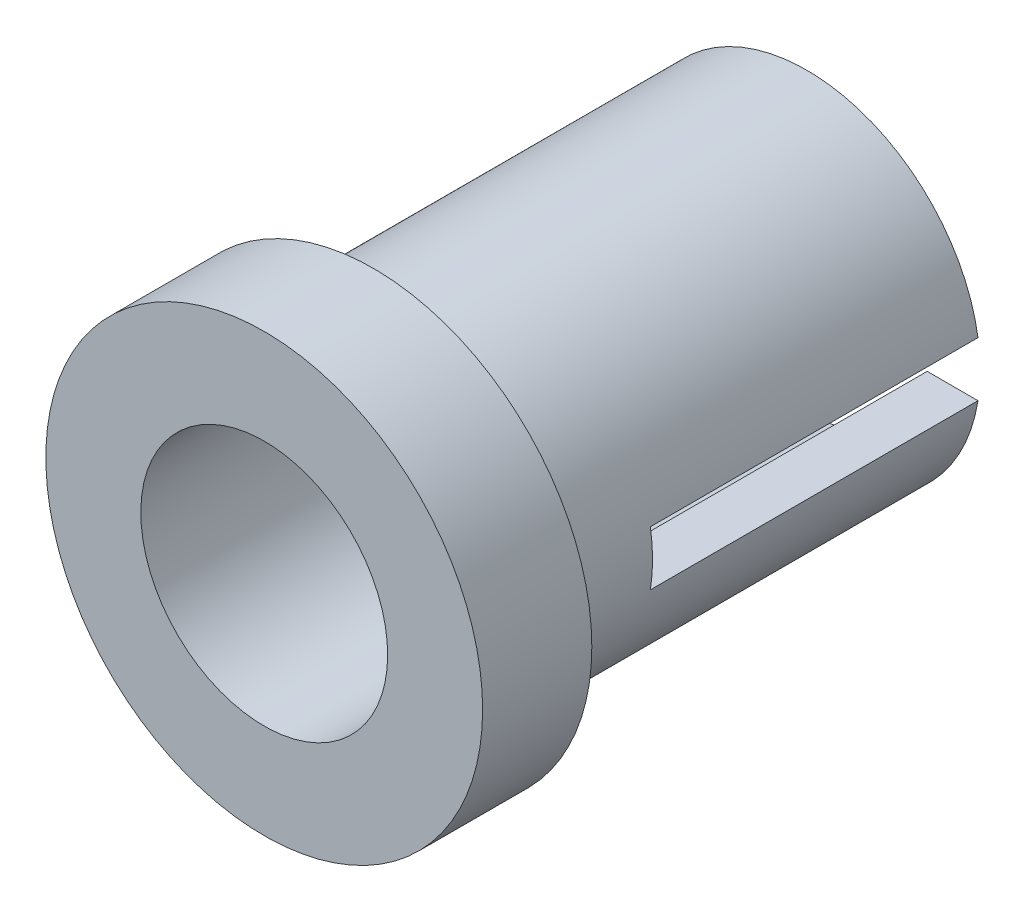
ISO-10303-21;
HEADER;
FILE_DESCRIPTION(('STEP AP214'),'2;1');
FILE_NAME('part.step','',(''),(''),'','','');
FILE_SCHEMA(('AUTOMOTIVE_DESIGN { 1 0 10303 214 1 1 1 1 }'));
ENDSEC;
DATA;
#1=APPLICATION_CONTEXT('core data for automotive mechanical design processes');
#2=APPLICATION_PROTOCOL_DEFINITION('international standard','automotive_design',2000,#1);
#3=PRODUCT_CONTEXT('',#1,'mechanical');
#4=PRODUCT('Part','Part','',(#3));
#5=PRODUCT_RELATED_PRODUCT_CATEGORY('part','',(#4));
#6=PRODUCT_DEFINITION_FORMATION('','',#4);
#7=PRODUCT_DEFINITION_CONTEXT('part definition',#1,'design');
#8=PRODUCT_DEFINITION('design','',#6,#7);
#9=PRODUCT_DEFINITION_SHAPE('','',#8);
#10=(LENGTH_UNIT() NAMED_UNIT(*) SI_UNIT(.MILLI.,.METRE.));
#11=(NAMED_UNIT(*) PLANE_ANGLE_UNIT() SI_UNIT($,.RADIAN.));
#12=(NAMED_UNIT(*) SI_UNIT($,.STERADIAN.) SOLID_ANGLE_UNIT());
#13=UNCERTAINTY_MEASURE_WITH_UNIT(LENGTH_MEASURE(1.E-05),#10,'distance_accuracy_value','');
#14=(GEOMETRIC_REPRESENTATION_CONTEXT(3) GLOBAL_UNCERTAINTY_ASSIGNED_CONTEXT((#13)) GLOBAL_UNIT_ASSIGNED_CONTEXT((#10,
#11,#12)) REPRESENTATION_CONTEXT('',''));
#15=CARTESIAN_POINT('',(0.,0.,0.));
#16=DIRECTION('',(0.,0.,1.));
#17=DIRECTION('',(1.,0.,0.));
#18=AXIS2_PLACEMENT_3D('',#15,#16,#17);
#19=CARTESIAN_POINT('',(0.,0.,0.));
#20=DIRECTION('',(0.,0.,1.));
#21=DIRECTION('',(1.,0.,0.));
#22=AXIS2_PLACEMENT_3D('',#19,#20,#21);
#23=PLANE('',#22);
#24=CARTESIAN_POINT('',(0.,0.,0.));
#25=DIRECTION('',(0.,0.,1.));
#26=DIRECTION('',(1.,0.,0.));
#27=AXIS2_PLACEMENT_3D('',#24,#25,#26);
#28=CIRCLE('',#27,1.5875);
#29=CARTESIAN_POINT('',(-1.56769137587728,-0.25,0.));
#30=VERTEX_POINT('',#29);
#31=CARTESIAN_POINT('',(1.56769137587728,-0.25,0.));
#32=VERTEX_POINT('',#31);
#33=EDGE_CURVE('E125',#30,#32,#28,.T.);
#34=ORIENTED_EDGE('',*,*,#33,.F.);
#35=DIRECTION('',(-1.,0.,0.));
#36=VECTOR('',#35,1.);
#37=CARTESIAN_POINT('',(2.14255861167853,-0.25,0.));
#38=LINE('',#37,#36);
#39=CARTESIAN_POINT('',(-1.10230580602662,-0.25,0.));
#40=VERTEX_POINT('',#39);
#41=EDGE_CURVE('E117',#40,#30,#38,.T.);
#42=ORIENTED_EDGE('',*,*,#41,.F.);
#43=CARTESIAN_POINT('',(0.,0.,0.));
#44=DIRECTION('',(0.,0.,1.));
#45=DIRECTION('',(1.,0.,0.));
#46=AXIS2_PLACEMENT_3D('',#43,#44,#45);
#47=CIRCLE('',#46,1.1303);
#48=CARTESIAN_POINT('',(1.10230580602662,-0.25,0.));
#49=VERTEX_POINT('',#48);
#50=EDGE_CURVE('E175',#40,#49,#47,.T.);
#51=ORIENTED_EDGE('',*,*,#50,.T.);
#52=EDGE_CURVE('E152',#32,#49,#38,.T.);
#53=ORIENTED_EDGE('',*,*,#52,.F.);
#54=EDGE_LOOP('',(#34,#42,#51,#53));
#55=FACE_BOUND('',#54,.T.);
#56=ADVANCED_FACE('F35',(#55),#23,.F.);
#57=CARTESIAN_POINT('',(1.56769137587728,0.25,0.));
#58=VERTEX_POINT('',#57);
#59=CARTESIAN_POINT('',(-1.56769137587728,0.25,0.));
#60=VERTEX_POINT('',#59);
#61=EDGE_CURVE('E114',#58,#60,#28,.T.);
#62=ORIENTED_EDGE('',*,*,#61,.F.);
#63=DIRECTION('',(1.,0.,0.));
#64=VECTOR('',#63,1.);
#65=CARTESIAN_POINT('',(2.14255861167853,0.25,0.));
#66=LINE('',#65,#64);
#67=CARTESIAN_POINT('',(1.10230580602662,0.25,0.));
#68=VERTEX_POINT('',#67);
#69=EDGE_CURVE('E118',#68,#58,#66,.T.);
#70=ORIENTED_EDGE('',*,*,#69,.F.);
#71=CARTESIAN_POINT('',(-1.10230580602662,0.25,0.));
#72=VERTEX_POINT('',#71);
#73=EDGE_CURVE('E116',#68,#72,#47,.T.);
#74=ORIENTED_EDGE('',*,*,#73,.T.);
#75=EDGE_CURVE('E101',#60,#72,#66,.T.);
#76=ORIENTED_EDGE('',*,*,#75,.F.);
#77=EDGE_LOOP('',(#62,#70,#74,#76));
#78=FACE_BOUND('',#77,.T.);
#79=ADVANCED_FACE('F112',(#78),#23,.F.);
#80=CARTESIAN_POINT('',(0.,0.,3.96875));
#81=DIRECTION('',(0.,0.,-1.));
#82=DIRECTION('',(-1.,0.,0.));
#83=AXIS2_PLACEMENT_3D('',#80,#81,#82);
#84=CYLINDRICAL_SURFACE('',#83,1.5875);
#85=ORIENTED_EDGE('',*,*,#33,.T.);
#86=DIRECTION('',(0.,0.,-1.));
#87=VECTOR('',#86,1.);
#88=CARTESIAN_POINT('',(1.56769137587728,-0.25,3.96875));
#89=LINE('',#88,#87);
#90=CARTESIAN_POINT('',(1.56769137587728,-0.25,3.));
#91=VERTEX_POINT('',#90);
#92=EDGE_CURVE('E162',#32,#91,#89,.F.);
#93=ORIENTED_EDGE('',*,*,#92,.T.);
#94=CARTESIAN_POINT('',(0.,0.,3.));
#95=DIRECTION('',(0.,0.,-1.));
#96=DIRECTION('',(-1.,0.,0.));
#97=AXIS2_PLACEMENT_3D('',#94,#95,#96);
#98=CIRCLE('',#97,1.5875);
#99=CARTESIAN_POINT('',(1.56769137587728,0.25,3.));
#100=VERTEX_POINT('',#99);
#101=EDGE_CURVE('E107',#100,#91,#98,.T.);
#102=ORIENTED_EDGE('',*,*,#101,.F.);
#103=DIRECTION('',(0.,0.,-1.));
#104=VECTOR('',#103,1.);
#105=CARTESIAN_POINT('',(1.56769137587728,0.25,3.96875));
#106=LINE('',#105,#104);
#107=EDGE_CURVE('E106',#100,#58,#106,.T.);
#108=ORIENTED_EDGE('',*,*,#107,.T.);
#109=ORIENTED_EDGE('',*,*,#61,.T.);
#110=DIRECTION('',(0.,0.,-1.));
#111=VECTOR('',#110,1.);
#112=CARTESIAN_POINT('',(-1.56769137587728,0.25,3.96875));
#113=LINE('',#112,#111);
#114=CARTESIAN_POINT('',(-1.56769137587728,0.25,3.));
#115=VERTEX_POINT('',#114);
#116=EDGE_CURVE('E98',#60,#115,#113,.F.);
#117=ORIENTED_EDGE('',*,*,#116,.T.);
#118=CARTESIAN_POINT('',(-1.56769137587728,-0.25,3.));
#119=VERTEX_POINT('',#118);
#120=EDGE_CURVE('E159',#119,#115,#98,.T.);
#121=ORIENTED_EDGE('',*,*,#120,.F.);
#122=DIRECTION('',(0.,0.,-1.));
#123=VECTOR('',#122,1.);
#124=CARTESIAN_POINT('',(-1.56769137587728,-0.25,3.96875));
#125=LINE('',#124,#123);
#126=EDGE_CURVE('E165',#119,#30,#125,.T.);
#127=ORIENTED_EDGE('',*,*,#126,.T.);
#128=EDGE_LOOP('',(#85,#93,#102,#108,#109,#117,#121,#127));
#129=FACE_BOUND('',#128,.T.);
#130=CARTESIAN_POINT('',(0.,0.,3.96875));
#131=DIRECTION('',(0.,0.,1.));
#132=DIRECTION('',(1.,0.,0.));
#133=AXIS2_PLACEMENT_3D('',#130,#131,#132);
#134=CIRCLE('',#133,1.5875);
#135=CARTESIAN_POINT('',(1.5875,0.,3.96875));
#136=VERTEX_POINT('',#135);
#137=EDGE_CURVE('E124',#136,#136,#134,.T.);
#138=ORIENTED_EDGE('',*,*,#137,.F.);
#139=EDGE_LOOP('',(#138));
#140=FACE_BOUND('',#139,.T.);
#141=ADVANCED_FACE('F37',(#129,#140),#84,.T.);
#142=CARTESIAN_POINT('',(0.,0.,3.96875));
#143=DIRECTION('',(0.,0.,-1.));
#144=DIRECTION('',(-1.,0.,0.));
#145=AXIS2_PLACEMENT_3D('',#142,#143,#144);
#146=CYLINDRICAL_SURFACE('',#145,1.1303);
#147=DIRECTION('',(0.,0.,-1.));
#148=VECTOR('',#147,1.);
#149=CARTESIAN_POINT('',(1.10230580602662,-0.25,3.96875));
#150=LINE('',#149,#148);
#151=CARTESIAN_POINT('',(1.10230580602662,-0.25,3.));
#152=VERTEX_POINT('',#151);
#153=EDGE_CURVE('E11',#49,#152,#150,.F.);
#154=ORIENTED_EDGE('',*,*,#153,.F.);
#155=ORIENTED_EDGE('',*,*,#50,.F.);
#156=DIRECTION('',(0.,0.,-1.));
#157=VECTOR('',#156,1.);
#158=CARTESIAN_POINT('',(-1.10230580602662,-0.25,3.96875));
#159=LINE('',#158,#157);
#160=CARTESIAN_POINT('',(-1.10230580602662,-0.25,3.));
#161=VERTEX_POINT('',#160);
#162=EDGE_CURVE('E137',#161,#40,#159,.T.);
#163=ORIENTED_EDGE('',*,*,#162,.F.);
#164=CARTESIAN_POINT('',(0.,0.,3.));
#165=DIRECTION('',(0.,0.,-1.));
#166=DIRECTION('',(-1.,0.,0.));
#167=AXIS2_PLACEMENT_3D('',#164,#165,#166);
#168=CIRCLE('',#167,1.1303);
#169=CARTESIAN_POINT('',(-1.10230580602662,0.25,3.));
#170=VERTEX_POINT('',#169);
#171=EDGE_CURVE('E128',#161,#170,#168,.T.);
#172=ORIENTED_EDGE('',*,*,#171,.T.);
#173=DIRECTION('',(0.,0.,-1.));
#174=VECTOR('',#173,1.);
#175=CARTESIAN_POINT('',(-1.10230580602662,0.25,3.96875));
#176=LINE('',#175,#174);
#177=EDGE_CURVE('E134',#72,#170,#176,.F.);
#178=ORIENTED_EDGE('',*,*,#177,.F.);
#179=ORIENTED_EDGE('',*,*,#73,.F.);
#180=DIRECTION('',(0.,0.,-1.));
#181=VECTOR('',#180,1.);
#182=CARTESIAN_POINT('',(1.10230580602662,0.25,3.96875));
#183=LINE('',#182,#181);
#184=CARTESIAN_POINT('',(1.10230580602662,0.25,3.));
#185=VERTEX_POINT('',#184);
#186=EDGE_CURVE('E43',#185,#68,#183,.T.);
#187=ORIENTED_EDGE('',*,*,#186,.F.);
#188=EDGE_CURVE('E135',#185,#152,#168,.T.);
#189=ORIENTED_EDGE('',*,*,#188,.T.);
#190=EDGE_LOOP('',(#154,#155,#163,#172,#178,#179,#187,#189));
#191=FACE_BOUND('',#190,.T.);
#192=CARTESIAN_POINT('',(0.,0.,4.96875));
#193=DIRECTION('',(0.,0.,1.));
#194=DIRECTION('',(1.,0.,0.));
#195=AXIS2_PLACEMENT_3D('',#192,#193,#194);
#196=CIRCLE('',#195,1.1303);
#197=CARTESIAN_POINT('',(1.1303,0.,4.96875));
#198=VERTEX_POINT('',#197);
#199=EDGE_CURVE('E169',#198,#198,#196,.F.);
#200=ORIENTED_EDGE('',*,*,#199,.F.);
#201=EDGE_LOOP('',(#200));
#202=FACE_BOUND('',#201,.T.);
#203=ADVANCED_FACE('F144',(#191,#202),#146,.F.);
#204=CARTESIAN_POINT('',(0.,0.,3.96875));
#205=DIRECTION('',(0.,0.,1.));
#206=DIRECTION('',(1.,0.,0.));
#207=AXIS2_PLACEMENT_3D('',#204,#205,#206);
#208=PLANE('',#207);
#209=CARTESIAN_POINT('',(0.,0.,3.96875));
#210=DIRECTION('',(0.,0.,1.));
#211=DIRECTION('',(1.,0.,0.));
#212=AXIS2_PLACEMENT_3D('',#209,#210,#211);
#213=CIRCLE('',#212,2.);
#214=CARTESIAN_POINT('',(2.,0.,3.96875));
#215=VERTEX_POINT('',#214);
#216=EDGE_CURVE('E168',#215,#215,#213,.T.);
#217=ORIENTED_EDGE('',*,*,#216,.F.);
#218=EDGE_LOOP('',(#217));
#219=FACE_BOUND('',#218,.T.);
#220=ORIENTED_EDGE('',*,*,#137,.T.);
#221=EDGE_LOOP('',(#220));
#222=FACE_BOUND('',#221,.T.);
#223=ADVANCED_FACE('F203',(#219,#222),#208,.F.);
#224=CARTESIAN_POINT('',(0.,0.,4.96875));
#225=DIRECTION('',(0.,0.,-1.));
#226=DIRECTION('',(-1.,0.,0.));
#227=AXIS2_PLACEMENT_3D('',#224,#225,#226);
#228=CYLINDRICAL_SURFACE('',#227,2.);
#229=CARTESIAN_POINT('',(0.,0.,4.96875));
#230=DIRECTION('',(0.,0.,1.));
#231=DIRECTION('',(1.,0.,0.));
#232=AXIS2_PLACEMENT_3D('',#229,#230,#231);
#233=CIRCLE('',#232,2.);
#234=CARTESIAN_POINT('',(2.,0.,4.96875));
#235=VERTEX_POINT('',#234);
#236=EDGE_CURVE('E172',#235,#235,#233,.T.);
#237=ORIENTED_EDGE('',*,*,#236,.F.);
#238=EDGE_LOOP('',(#237));
#239=FACE_BOUND('',#238,.T.);
#240=ORIENTED_EDGE('',*,*,#216,.T.);
#241=EDGE_LOOP('',(#240));
#242=FACE_BOUND('',#241,.T.);
#243=ADVANCED_FACE('F204',(#239,#242),#228,.T.);
#244=CARTESIAN_POINT('',(0.,0.,4.96875));
#245=DIRECTION('',(0.,0.,1.));
#246=DIRECTION('',(1.,0.,0.));
#247=AXIS2_PLACEMENT_3D('',#244,#245,#246);
#248=PLANE('',#247);
#249=ORIENTED_EDGE('',*,*,#199,.T.);
#250=EDGE_LOOP('',(#249));
#251=FACE_BOUND('',#250,.T.);
#252=ORIENTED_EDGE('',*,*,#236,.T.);
#253=EDGE_LOOP('',(#252));
#254=FACE_BOUND('',#253,.T.);
#255=ADVANCED_FACE('F207',(#251,#254),#248,.T.);
#256=CARTESIAN_POINT('',(0.,0.,3.));
#257=DIRECTION('',(0.,0.,-1.));
#258=DIRECTION('',(-1.,0.,0.));
#259=AXIS2_PLACEMENT_3D('',#256,#257,#258);
#260=PLANE('',#259);
#261=ORIENTED_EDGE('',*,*,#120,.T.);
#262=DIRECTION('',(1.,0.,0.));
#263=VECTOR('',#262,1.);
#264=CARTESIAN_POINT('',(2.14255861167853,0.25,3.));
#265=LINE('',#264,#263);
#266=EDGE_CURVE('E57',#115,#170,#265,.T.);
#267=ORIENTED_EDGE('',*,*,#266,.T.);
#268=ORIENTED_EDGE('',*,*,#171,.F.);
#269=DIRECTION('',(-1.,0.,0.));
#270=VECTOR('',#269,1.);
#271=CARTESIAN_POINT('',(2.14255861167853,-0.25,3.));
#272=LINE('',#271,#270);
#273=EDGE_CURVE('E154',#161,#119,#272,.T.);
#274=ORIENTED_EDGE('',*,*,#273,.T.);
#275=EDGE_LOOP('',(#261,#267,#268,#274));
#276=FACE_BOUND('',#275,.T.);
#277=ADVANCED_FACE('F185',(#276),#260,.T.);
#278=CARTESIAN_POINT('',(2.14255861167853,0.25,3.));
#279=DIRECTION('',(0.,1.,0.));
#280=DIRECTION('',(0.,0.,1.));
#281=AXIS2_PLACEMENT_3D('',#278,#279,#280);
#282=PLANE('',#281);
#283=ORIENTED_EDGE('',*,*,#75,.T.);
#284=ORIENTED_EDGE('',*,*,#177,.T.);
#285=ORIENTED_EDGE('',*,*,#266,.F.);
#286=ORIENTED_EDGE('',*,*,#116,.F.);
#287=EDGE_LOOP('',(#283,#284,#285,#286));
#288=FACE_BOUND('',#287,.T.);
#289=ADVANCED_FACE('F100',(#288),#282,.F.);
#290=CARTESIAN_POINT('',(2.14255861167853,-0.25,3.));
#291=DIRECTION('',(0.,-1.,0.));
#292=DIRECTION('',(0.,0.,-1.));
#293=AXIS2_PLACEMENT_3D('',#290,#291,#292);
#294=PLANE('',#293);
#295=ORIENTED_EDGE('',*,*,#273,.F.);
#296=ORIENTED_EDGE('',*,*,#162,.T.);
#297=ORIENTED_EDGE('',*,*,#41,.T.);
#298=ORIENTED_EDGE('',*,*,#126,.F.);
#299=EDGE_LOOP('',(#295,#296,#297,#298));
#300=FACE_BOUND('',#299,.T.);
#301=ADVANCED_FACE('F184',(#300),#294,.F.);
#302=ORIENTED_EDGE('',*,*,#52,.T.);
#303=ORIENTED_EDGE('',*,*,#153,.T.);
#304=EDGE_CURVE('E50',#91,#152,#272,.T.);
#305=ORIENTED_EDGE('',*,*,#304,.F.);
#306=ORIENTED_EDGE('',*,*,#92,.F.);
#307=EDGE_LOOP('',(#302,#303,#305,#306));
#308=FACE_BOUND('',#307,.T.);
#309=ADVANCED_FACE('F187',(#308),#294,.F.);
#310=EDGE_CURVE('E150',#185,#100,#265,.T.);
#311=ORIENTED_EDGE('',*,*,#310,.F.);
#312=ORIENTED_EDGE('',*,*,#186,.T.);
#313=ORIENTED_EDGE('',*,*,#69,.T.);
#314=ORIENTED_EDGE('',*,*,#107,.F.);
#315=EDGE_LOOP('',(#311,#312,#313,#314));
#316=FACE_BOUND('',#315,.T.);
#317=ADVANCED_FACE('F151',(#316),#282,.F.);
#318=ORIENTED_EDGE('',*,*,#101,.T.);
#319=ORIENTED_EDGE('',*,*,#304,.T.);
#320=ORIENTED_EDGE('',*,*,#188,.F.);
#321=ORIENTED_EDGE('',*,*,#310,.T.);
#322=EDGE_LOOP('',(#318,#319,#320,#321));
#323=FACE_BOUND('',#322,.T.);
#324=ADVANCED_FACE('F149',(#323),#260,.T.);
#325=CLOSED_SHELL('',(#56,#79,#141,#203,#223,#243,#255,#277,#289,#301,#309,#317,#324));
#326=MANIFOLD_SOLID_BREP('B2',#325);
#327=ADVANCED_BREP_SHAPE_REPRESENTATION('',(#18,#326),#14);
#328=SHAPE_DEFINITION_REPRESENTATION(#9,#327);
ENDSEC;
END-ISO-10303-21;
